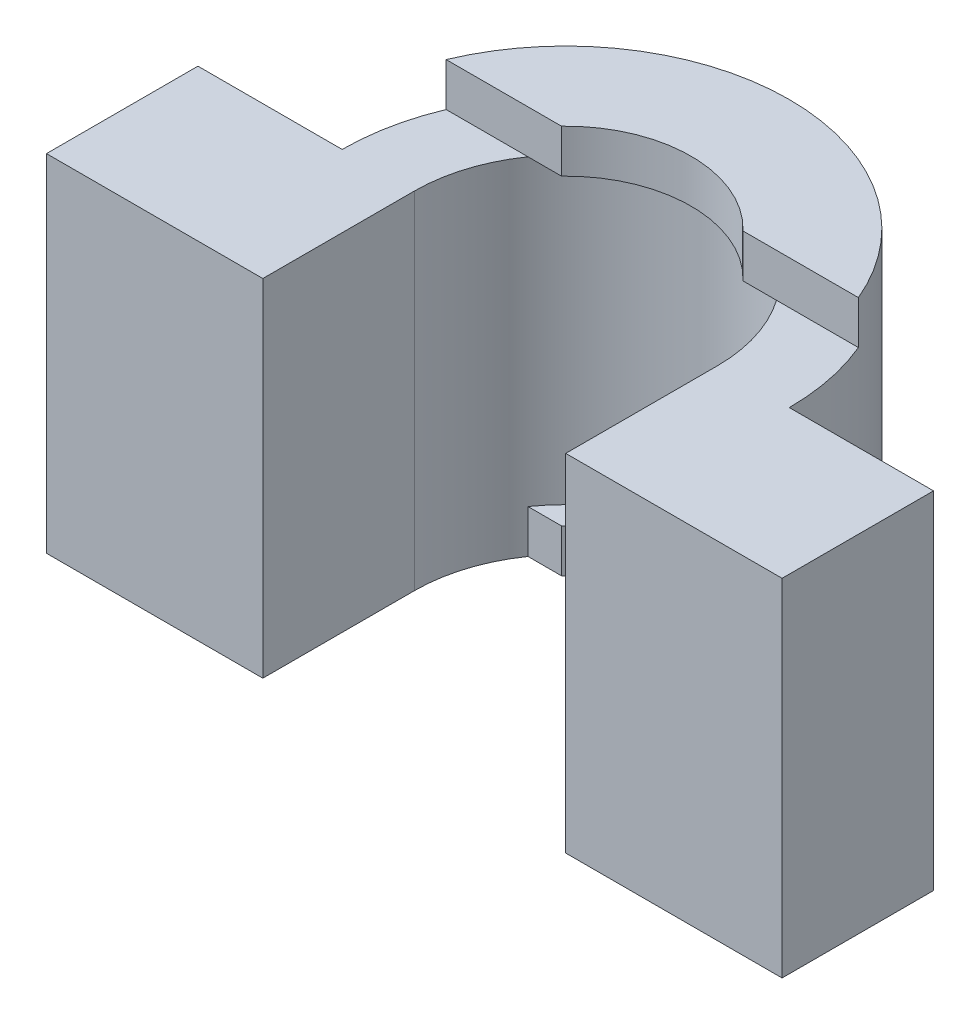
ISO-10303-21;
HEADER;
FILE_DESCRIPTION(('STEP AP214'),'2;1');
FILE_NAME('part.step','',(''),(''),'','','');
FILE_SCHEMA(('AUTOMOTIVE_DESIGN { 1 0 10303 214 1 1 1 1 }'));
ENDSEC;
DATA;
#1=APPLICATION_CONTEXT('core data for automotive mechanical design processes');
#2=APPLICATION_PROTOCOL_DEFINITION('international standard','automotive_design',2000,#1);
#3=PRODUCT_CONTEXT('',#1,'mechanical');
#4=PRODUCT('Part','Part','',(#3));
#5=PRODUCT_RELATED_PRODUCT_CATEGORY('part','',(#4));
#6=PRODUCT_DEFINITION_FORMATION('','',#4);
#7=PRODUCT_DEFINITION_CONTEXT('part definition',#1,'design');
#8=PRODUCT_DEFINITION('design','',#6,#7);
#9=PRODUCT_DEFINITION_SHAPE('','',#8);
#10=(LENGTH_UNIT() NAMED_UNIT(*) SI_UNIT(.MILLI.,.METRE.));
#11=(NAMED_UNIT(*) PLANE_ANGLE_UNIT() SI_UNIT($,.RADIAN.));
#12=(NAMED_UNIT(*) SI_UNIT($,.STERADIAN.) SOLID_ANGLE_UNIT());
#13=UNCERTAINTY_MEASURE_WITH_UNIT(LENGTH_MEASURE(1.E-05),#10,'distance_accuracy_value','');
#14=(GEOMETRIC_REPRESENTATION_CONTEXT(3) GLOBAL_UNCERTAINTY_ASSIGNED_CONTEXT((#13)) GLOBAL_UNIT_ASSIGNED_CONTEXT((#10,
#11,#12)) REPRESENTATION_CONTEXT('',''));
#15=CARTESIAN_POINT('',(0.,0.,0.));
#16=DIRECTION('',(0.,0.,1.));
#17=DIRECTION('',(1.,0.,0.));
#18=AXIS2_PLACEMENT_3D('',#15,#16,#17);
#19=CARTESIAN_POINT('',(10.4344630708231,-3.,-7.42857142857143));
#20=DIRECTION('',(0.,0.,-1.));
#21=DIRECTION('',(-1.,0.,0.));
#22=AXIS2_PLACEMENT_3D('',#19,#20,#21);
#23=PLANE('',#22);
#24=DIRECTION('',(0.,1.,0.));
#25=VECTOR('',#24,1.);
#26=CARTESIAN_POINT('',(4.75970111266418,-3.,-7.42857142857143));
#27=LINE('',#26,#25);
#28=CARTESIAN_POINT('',(4.75970111266418,-3.,-7.42857142857143));
#29=VERTEX_POINT('',#28);
#30=CARTESIAN_POINT('',(4.75970111266418,0.,-7.42857142857143));
#31=VERTEX_POINT('',#30);
#32=EDGE_CURVE('E52',#29,#31,#27,.T.);
#33=ORIENTED_EDGE('',*,*,#32,.T.);
#34=DIRECTION('',(-1.,0.,0.));
#35=VECTOR('',#34,1.);
#36=CARTESIAN_POINT('',(10.4344630708231,0.,-7.42857142857143));
#37=LINE('',#36,#35);
#38=CARTESIAN_POINT('',(2.43446307082313,0.,-7.42857142857143));
#39=VERTEX_POINT('',#38);
#40=EDGE_CURVE('E219',#31,#39,#37,.T.);
#41=ORIENTED_EDGE('',*,*,#40,.T.);
#42=DIRECTION('',(0.,1.,0.));
#43=VECTOR('',#42,1.);
#44=CARTESIAN_POINT('',(2.43446307082313,-3.,-7.42857142857143));
#45=LINE('',#44,#43);
#46=CARTESIAN_POINT('',(2.43446307082313,-3.,-7.42857142857143));
#47=VERTEX_POINT('',#46);
#48=EDGE_CURVE('E235',#47,#39,#45,.T.);
#49=ORIENTED_EDGE('',*,*,#48,.F.);
#50=DIRECTION('',(-1.,0.,0.));
#51=VECTOR('',#50,1.);
#52=CARTESIAN_POINT('',(10.4344630708231,-3.,-7.42857142857143));
#53=LINE('',#52,#51);
#54=EDGE_CURVE('E189',#29,#47,#53,.T.);
#55=ORIENTED_EDGE('',*,*,#54,.F.);
#56=EDGE_LOOP('',(#33,#41,#49,#55));
#57=FACE_BOUND('',#56,.T.);
#58=ADVANCED_FACE('F35',(#57),#23,.F.);
#59=CARTESIAN_POINT('',(-10.1487487851089,-3.,-7.42857142857143));
#60=DIRECTION('',(0.,0.,-1.));
#61=DIRECTION('',(-1.,0.,0.));
#62=AXIS2_PLACEMENT_3D('',#59,#60,#61);
#63=PLANE('',#62);
#64=DIRECTION('',(0.,1.,0.));
#65=VECTOR('',#64,1.);
#66=CARTESIAN_POINT('',(-12.4739868269499,-3.,-7.42857142857143));
#67=LINE('',#66,#65);
#68=CARTESIAN_POINT('',(-12.4739868269499,-3.,-7.42857142857143));
#69=VERTEX_POINT('',#68);
#70=CARTESIAN_POINT('',(-12.4739868269499,0.,-7.42857142857143));
#71=VERTEX_POINT('',#70);
#72=EDGE_CURVE('E218',#69,#71,#67,.T.);
#73=ORIENTED_EDGE('',*,*,#72,.F.);
#74=DIRECTION('',(-1.,0.,0.));
#75=VECTOR('',#74,1.);
#76=CARTESIAN_POINT('',(-10.1487487851089,-3.,-7.42857142857143));
#77=LINE('',#76,#75);
#78=CARTESIAN_POINT('',(-10.1487487851088,-3.,-7.42857142857143));
#79=VERTEX_POINT('',#78);
#80=EDGE_CURVE('E224',#79,#69,#77,.T.);
#81=ORIENTED_EDGE('',*,*,#80,.F.);
#82=DIRECTION('',(0.,1.,0.));
#83=VECTOR('',#82,1.);
#84=CARTESIAN_POINT('',(-10.1487487851088,-3.,-7.42857142857143));
#85=LINE('',#84,#83);
#86=CARTESIAN_POINT('',(-10.1487487851088,0.,-7.42857142857143));
#87=VERTEX_POINT('',#86);
#88=EDGE_CURVE('E227',#79,#87,#85,.T.);
#89=ORIENTED_EDGE('',*,*,#88,.T.);
#90=DIRECTION('',(-1.,0.,0.));
#91=VECTOR('',#90,1.);
#92=CARTESIAN_POINT('',(-10.1487487851089,0.,-7.42857142857143));
#93=LINE('',#92,#91);
#94=EDGE_CURVE('E190',#87,#71,#93,.T.);
#95=ORIENTED_EDGE('',*,*,#94,.T.);
#96=EDGE_LOOP('',(#73,#81,#89,#95));
#97=FACE_BOUND('',#96,.T.);
#98=ADVANCED_FACE('F371',(#97),#63,.F.);
#99=CARTESIAN_POINT('',(0.,21.,0.));
#100=DIRECTION('',(0.,1.,0.));
#101=DIRECTION('',(0.,0.,1.));
#102=AXIS2_PLACEMENT_3D('',#99,#100,#101);
#103=PLANE('',#102);
#104=DIRECTION('',(1.,0.,0.));
#105=VECTOR('',#104,1.);
#106=CARTESIAN_POINT('',(2.43446340044912,21.,-7.42857142857143));
#107=LINE('',#106,#105);
#108=CARTESIAN_POINT('',(4.75970111266418,21.,-7.42857142857143));
#109=VERTEX_POINT('',#108);
#110=CARTESIAN_POINT('',(10.4344630708136,21.,-7.42857142857143));
#111=VERTEX_POINT('',#110);
#112=EDGE_CURVE('E11',#109,#111,#107,.T.);
#113=ORIENTED_EDGE('',*,*,#112,.F.);
#114=CARTESIAN_POINT('',(-3.85714285714286,21.,-1.42857142857142));
#115=DIRECTION('',(0.,1.,0.));
#116=DIRECTION('',(0.,0.,1.));
#117=AXIS2_PLACEMENT_3D('',#114,#115,#116);
#118=CIRCLE('',#117,10.5);
#119=CARTESIAN_POINT('',(6.64285714285714,21.,-1.42857142857143));
#120=VERTEX_POINT('',#119);
#121=EDGE_CURVE('E316',#109,#120,#118,.F.);
#122=ORIENTED_EDGE('',*,*,#121,.T.);
#123=DIRECTION('',(0.,0.,1.));
#124=VECTOR('',#123,1.);
#125=CARTESIAN_POINT('',(6.64285714285714,21.,0.));
#126=LINE('',#125,#124);
#127=CARTESIAN_POINT('',(6.64285714285714,21.,9.07142857142857));
#128=VERTEX_POINT('',#127);
#129=EDGE_CURVE('E311',#120,#128,#126,.T.);
#130=ORIENTED_EDGE('',*,*,#129,.T.);
#131=DIRECTION('',(1.,0.,0.));
#132=VECTOR('',#131,1.);
#133=CARTESIAN_POINT('',(0.,21.,9.07142857142857));
#134=LINE('',#133,#132);
#135=CARTESIAN_POINT('',(21.6428571428571,21.,9.07142857142857));
#136=VERTEX_POINT('',#135);
#137=EDGE_CURVE('E309',#128,#136,#134,.T.);
#138=ORIENTED_EDGE('',*,*,#137,.T.);
#139=DIRECTION('',(0.,0.,1.));
#140=VECTOR('',#139,1.);
#141=CARTESIAN_POINT('',(21.6428571428571,21.,0.));
#142=LINE('',#141,#140);
#143=CARTESIAN_POINT('',(21.6428571428571,21.,-1.42857142857143));
#144=VERTEX_POINT('',#143);
#145=EDGE_CURVE('E306',#144,#136,#142,.T.);
#146=ORIENTED_EDGE('',*,*,#145,.F.);
#147=DIRECTION('',(1.,0.,0.));
#148=VECTOR('',#147,1.);
#149=CARTESIAN_POINT('',(0.,21.,-1.42857142857143));
#150=LINE('',#149,#148);
#151=CARTESIAN_POINT('',(11.6428571428571,21.,-1.42857142857143));
#152=VERTEX_POINT('',#151);
#153=EDGE_CURVE('E178',#152,#144,#150,.T.);
#154=ORIENTED_EDGE('',*,*,#153,.F.);
#155=CARTESIAN_POINT('',(-3.85714285714286,21.,-1.42857142857143));
#156=DIRECTION('',(0.,1.,0.));
#157=DIRECTION('',(0.,0.,1.));
#158=AXIS2_PLACEMENT_3D('',#155,#156,#157);
#159=CIRCLE('',#158,15.5);
#160=EDGE_CURVE('E172',#111,#152,#159,.F.);
#161=ORIENTED_EDGE('',*,*,#160,.F.);
#162=EDGE_LOOP('',(#113,#122,#130,#138,#146,#154,#161));
#163=FACE_BOUND('',#162,.T.);
#164=ADVANCED_FACE('F377',(#163),#103,.T.);
#165=CARTESIAN_POINT('',(-3.85714285714286,21.,-1.42857142857143));
#166=DIRECTION('',(0.,-1.,0.));
#167=DIRECTION('',(0.,0.,-1.));
#168=AXIS2_PLACEMENT_3D('',#165,#166,#167);
#169=CYLINDRICAL_SURFACE('',#168,15.5);
#170=DIRECTION('',(0.,-1.,0.));
#171=VECTOR('',#170,1.);
#172=CARTESIAN_POINT('',(11.6428571428571,21.,-1.42857142857143));
#173=LINE('',#172,#171);
#174=CARTESIAN_POINT('',(11.6428571428571,-3.,-1.42857142857143));
#175=VERTEX_POINT('',#174);
#176=EDGE_CURVE('E167',#152,#175,#173,.T.);
#177=ORIENTED_EDGE('',*,*,#176,.T.);
#178=CARTESIAN_POINT('',(-3.85714285714286,-3.,-1.42857142857143));
#179=DIRECTION('',(0.,-1.,0.));
#180=DIRECTION('',(0.,0.,1.));
#181=AXIS2_PLACEMENT_3D('',#178,#179,#180);
#182=CIRCLE('',#181,15.5000000000088);
#183=CARTESIAN_POINT('',(-19.3571428571429,-3.,-1.42857142857143));
#184=VERTEX_POINT('',#183);
#185=EDGE_CURVE('E169',#184,#175,#182,.T.);
#186=ORIENTED_EDGE('',*,*,#185,.F.);
#187=DIRECTION('',(0.,-1.,0.));
#188=VECTOR('',#187,1.);
#189=CARTESIAN_POINT('',(-19.3571428571429,21.,-1.42857142857143));
#190=LINE('',#189,#188);
#191=CARTESIAN_POINT('',(-19.3571428571429,21.,-1.42857142857143));
#192=VERTEX_POINT('',#191);
#193=EDGE_CURVE('E44',#192,#184,#190,.T.);
#194=ORIENTED_EDGE('',*,*,#193,.F.);
#195=CARTESIAN_POINT('',(-18.1487487850993,21.,-7.42857142857143));
#196=VERTEX_POINT('',#195);
#197=EDGE_CURVE('E285',#192,#196,#159,.F.);
#198=ORIENTED_EDGE('',*,*,#197,.T.);
#199=DIRECTION('',(0.,-1.,0.));
#200=VECTOR('',#199,1.);
#201=CARTESIAN_POINT('',(-18.1487491147348,24.,-7.42857142857143));
#202=LINE('',#201,#200);
#203=CARTESIAN_POINT('',(-18.1487491147348,24.,-7.42857142857143));
#204=VERTEX_POINT('',#203);
#205=EDGE_CURVE('E259',#204,#196,#202,.T.);
#206=ORIENTED_EDGE('',*,*,#205,.F.);
#207=CARTESIAN_POINT('',(-3.85714285714286,24.,-1.42857142857143));
#208=DIRECTION('',(0.,1.,0.));
#209=DIRECTION('',(0.,0.,-1.));
#210=AXIS2_PLACEMENT_3D('',#207,#208,#209);
#211=CIRCLE('',#210,15.5000003039368);
#212=CARTESIAN_POINT('',(10.4344634004491,24.,-7.42857142857143));
#213=VERTEX_POINT('',#212);
#214=EDGE_CURVE('E239',#213,#204,#211,.T.);
#215=ORIENTED_EDGE('',*,*,#214,.F.);
#216=DIRECTION('',(0.,-1.,0.));
#217=VECTOR('',#216,1.);
#218=CARTESIAN_POINT('',(10.4344634004491,24.,-7.42857142857143));
#219=LINE('',#218,#217);
#220=EDGE_CURVE('E249',#213,#111,#219,.T.);
#221=ORIENTED_EDGE('',*,*,#220,.T.);
#222=ORIENTED_EDGE('',*,*,#160,.T.);
#223=EDGE_LOOP('',(#177,#186,#194,#198,#206,#215,#221,#222));
#224=FACE_BOUND('',#223,.T.);
#225=ADVANCED_FACE('F37',(#224),#169,.T.);
#226=CARTESIAN_POINT('',(0.,21.,-1.42857142857143));
#227=DIRECTION('',(0.,0.,1.));
#228=DIRECTION('',(1.,0.,0.));
#229=AXIS2_PLACEMENT_3D('',#226,#227,#228);
#230=PLANE('',#229);
#231=ORIENTED_EDGE('',*,*,#193,.T.);
#232=DIRECTION('',(1.,0.,0.));
#233=VECTOR('',#232,1.);
#234=CARTESIAN_POINT('',(-29.3571428571429,-3.,-1.42857142857143));
#235=LINE('',#234,#233);
#236=CARTESIAN_POINT('',(-29.3571428571429,-3.,-1.42857142857143));
#237=VERTEX_POINT('',#236);
#238=EDGE_CURVE('E188',#237,#184,#235,.T.);
#239=ORIENTED_EDGE('',*,*,#238,.F.);
#240=DIRECTION('',(0.,-1.,0.));
#241=VECTOR('',#240,1.);
#242=CARTESIAN_POINT('',(-29.3571428571429,21.,-1.42857142857143));
#243=LINE('',#242,#241);
#244=CARTESIAN_POINT('',(-29.3571428571429,21.,-1.42857142857143));
#245=VERTEX_POINT('',#244);
#246=EDGE_CURVE('E289',#245,#237,#243,.T.);
#247=ORIENTED_EDGE('',*,*,#246,.F.);
#248=DIRECTION('',(-1.,0.,0.));
#249=VECTOR('',#248,1.);
#250=CARTESIAN_POINT('',(0.,21.,-1.42857142857143));
#251=LINE('',#250,#249);
#252=EDGE_CURVE('E281',#192,#245,#251,.T.);
#253=ORIENTED_EDGE('',*,*,#252,.F.);
#254=EDGE_LOOP('',(#231,#239,#247,#253));
#255=FACE_BOUND('',#254,.T.);
#256=ADVANCED_FACE('F330',(#255),#230,.F.);
#257=CARTESIAN_POINT('',(-29.3571428571429,21.,0.));
#258=DIRECTION('',(1.,0.,0.));
#259=DIRECTION('',(0.,0.,-1.));
#260=AXIS2_PLACEMENT_3D('',#257,#258,#259);
#261=PLANE('',#260);
#262=ORIENTED_EDGE('',*,*,#246,.T.);
#263=DIRECTION('',(0.,0.,-1.));
#264=VECTOR('',#263,1.);
#265=CARTESIAN_POINT('',(-29.3571428571429,-3.,9.07142857142858));
#266=LINE('',#265,#264);
#267=CARTESIAN_POINT('',(-29.3571428571429,-3.,9.07142857142858));
#268=VERTEX_POINT('',#267);
#269=EDGE_CURVE('E215',#268,#237,#266,.T.);
#270=ORIENTED_EDGE('',*,*,#269,.F.);
#271=DIRECTION('',(0.,-1.,0.));
#272=VECTOR('',#271,1.);
#273=CARTESIAN_POINT('',(-29.3571428571429,21.,9.07142857142858));
#274=LINE('',#273,#272);
#275=CARTESIAN_POINT('',(-29.3571428571429,21.,9.07142857142858));
#276=VERTEX_POINT('',#275);
#277=EDGE_CURVE('E291',#276,#268,#274,.T.);
#278=ORIENTED_EDGE('',*,*,#277,.F.);
#279=DIRECTION('',(0.,0.,1.));
#280=VECTOR('',#279,1.);
#281=CARTESIAN_POINT('',(-29.3571428571429,21.,0.));
#282=LINE('',#281,#280);
#283=EDGE_CURVE('E321',#245,#276,#282,.T.);
#284=ORIENTED_EDGE('',*,*,#283,.F.);
#285=EDGE_LOOP('',(#262,#270,#278,#284));
#286=FACE_BOUND('',#285,.T.);
#287=ADVANCED_FACE('F333',(#286),#261,.F.);
#288=CARTESIAN_POINT('',(0.,21.,9.07142857142858));
#289=DIRECTION('',(0.,0.,-1.));
#290=DIRECTION('',(-1.,0.,0.));
#291=AXIS2_PLACEMENT_3D('',#288,#289,#290);
#292=PLANE('',#291);
#293=ORIENTED_EDGE('',*,*,#277,.T.);
#294=DIRECTION('',(-1.,0.,0.));
#295=VECTOR('',#294,1.);
#296=CARTESIAN_POINT('',(-14.3571428571429,-3.,9.07142857142858));
#297=LINE('',#296,#295);
#298=CARTESIAN_POINT('',(-14.3571428571429,-3.,9.07142857142858));
#299=VERTEX_POINT('',#298);
#300=EDGE_CURVE('E212',#299,#268,#297,.T.);
#301=ORIENTED_EDGE('',*,*,#300,.F.);
#302=DIRECTION('',(0.,-1.,0.));
#303=VECTOR('',#302,1.);
#304=CARTESIAN_POINT('',(-14.3571428571429,21.,9.07142857142858));
#305=LINE('',#304,#303);
#306=CARTESIAN_POINT('',(-14.3571428571429,21.,9.07142857142858));
#307=VERTEX_POINT('',#306);
#308=EDGE_CURVE('E293',#307,#299,#305,.T.);
#309=ORIENTED_EDGE('',*,*,#308,.F.);
#310=DIRECTION('',(1.,0.,0.));
#311=VECTOR('',#310,1.);
#312=CARTESIAN_POINT('',(0.,21.,9.07142857142858));
#313=LINE('',#312,#311);
#314=EDGE_CURVE('E320',#276,#307,#313,.T.);
#315=ORIENTED_EDGE('',*,*,#314,.F.);
#316=EDGE_LOOP('',(#293,#301,#309,#315));
#317=FACE_BOUND('',#316,.T.);
#318=ADVANCED_FACE('F338',(#317),#292,.F.);
#319=CARTESIAN_POINT('',(-14.3571428571429,21.,0.));
#320=DIRECTION('',(1.,0.,0.));
#321=DIRECTION('',(0.,0.,-1.));
#322=AXIS2_PLACEMENT_3D('',#319,#320,#321);
#323=PLANE('',#322);
#324=ORIENTED_EDGE('',*,*,#308,.T.);
#325=DIRECTION('',(0.,0.,1.));
#326=VECTOR('',#325,1.);
#327=CARTESIAN_POINT('',(-14.3571428571429,-3.,-1.42857142857143));
#328=LINE('',#327,#326);
#329=CARTESIAN_POINT('',(-14.3571428571429,-3.,-1.42857142857142));
#330=VERTEX_POINT('',#329);
#331=EDGE_CURVE('E209',#330,#299,#328,.T.);
#332=ORIENTED_EDGE('',*,*,#331,.F.);
#333=DIRECTION('',(0.,-1.,0.));
#334=VECTOR('',#333,1.);
#335=CARTESIAN_POINT('',(-14.3571428571429,21.,-1.42857142857143));
#336=LINE('',#335,#334);
#337=CARTESIAN_POINT('',(-14.3571428571429,21.,-1.42857142857143));
#338=VERTEX_POINT('',#337);
#339=EDGE_CURVE('E295',#338,#330,#336,.T.);
#340=ORIENTED_EDGE('',*,*,#339,.F.);
#341=DIRECTION('',(0.,0.,1.));
#342=VECTOR('',#341,1.);
#343=CARTESIAN_POINT('',(-14.3571428571429,21.,0.));
#344=LINE('',#343,#342);
#345=EDGE_CURVE('E317',#338,#307,#344,.T.);
#346=ORIENTED_EDGE('',*,*,#345,.T.);
#347=EDGE_LOOP('',(#324,#332,#340,#346));
#348=FACE_BOUND('',#347,.T.);
#349=ADVANCED_FACE('F343',(#348),#323,.T.);
#350=CARTESIAN_POINT('',(-3.85714285714286,21.,-1.42857142857142));
#351=DIRECTION('',(0.,-1.,0.));
#352=DIRECTION('',(0.,0.,-1.));
#353=AXIS2_PLACEMENT_3D('',#350,#351,#352);
#354=CYLINDRICAL_SURFACE('',#353,10.5);
#355=ORIENTED_EDGE('',*,*,#339,.T.);
#356=CARTESIAN_POINT('',(-3.85714285714286,-3.,-1.42857142857142));
#357=DIRECTION('',(0.,1.,0.));
#358=DIRECTION('',(0.,0.,-1.));
#359=AXIS2_PLACEMENT_3D('',#356,#357,#358);
#360=CIRCLE('',#359,10.5);
#361=EDGE_CURVE('E206',#69,#330,#360,.T.);
#362=ORIENTED_EDGE('',*,*,#361,.F.);
#363=ORIENTED_EDGE('',*,*,#72,.T.);
#364=CARTESIAN_POINT('',(-3.85714285714286,0.,-1.42857142857142));
#365=DIRECTION('',(0.,1.,0.));
#366=DIRECTION('',(0.,0.,1.));
#367=AXIS2_PLACEMENT_3D('',#364,#365,#366);
#368=CIRCLE('',#367,10.5);
#369=EDGE_CURVE('E262',#71,#31,#368,.F.);
#370=ORIENTED_EDGE('',*,*,#369,.T.);
#371=ORIENTED_EDGE('',*,*,#32,.F.);
#372=CARTESIAN_POINT('',(-3.85714285714286,-3.,-1.42857142857142));
#373=DIRECTION('',(0.,1.,0.));
#374=DIRECTION('',(0.,0.,-1.));
#375=AXIS2_PLACEMENT_3D('',#372,#373,#374);
#376=CIRCLE('',#375,10.5);
#377=CARTESIAN_POINT('',(6.64285714285714,-3.,-1.42857142857143));
#378=VERTEX_POINT('',#377);
#379=EDGE_CURVE('E194',#378,#29,#376,.T.);
#380=ORIENTED_EDGE('',*,*,#379,.F.);
#381=DIRECTION('',(0.,-1.,0.));
#382=VECTOR('',#381,1.);
#383=CARTESIAN_POINT('',(6.64285714285714,21.,-1.42857142857143));
#384=LINE('',#383,#382);
#385=EDGE_CURVE('E297',#120,#378,#384,.T.);
#386=ORIENTED_EDGE('',*,*,#385,.F.);
#387=ORIENTED_EDGE('',*,*,#121,.F.);
#388=CARTESIAN_POINT('',(-12.4739868269499,21.,-7.42857142857143));
#389=VERTEX_POINT('',#388);
#390=EDGE_CURVE('E315',#389,#109,#118,.F.);
#391=ORIENTED_EDGE('',*,*,#390,.F.);
#392=EDGE_CURVE('E313',#338,#389,#118,.F.);
#393=ORIENTED_EDGE('',*,*,#392,.F.);
#394=EDGE_LOOP('',(#355,#362,#363,#370,#371,#380,#386,#387,#391,#393));
#395=FACE_BOUND('',#394,.T.);
#396=ADVANCED_FACE('F345',(#395),#354,.F.);
#397=CARTESIAN_POINT('',(6.64285714285714,21.,0.));
#398=DIRECTION('',(1.,0.,0.));
#399=DIRECTION('',(0.,0.,-1.));
#400=AXIS2_PLACEMENT_3D('',#397,#398,#399);
#401=PLANE('',#400);
#402=ORIENTED_EDGE('',*,*,#385,.T.);
#403=DIRECTION('',(0.,0.,-1.));
#404=VECTOR('',#403,1.);
#405=CARTESIAN_POINT('',(6.64285714285714,-3.,9.07142857142857));
#406=LINE('',#405,#404);
#407=CARTESIAN_POINT('',(6.64285714285714,-3.,9.07142857142857));
#408=VERTEX_POINT('',#407);
#409=EDGE_CURVE('E202',#408,#378,#406,.T.);
#410=ORIENTED_EDGE('',*,*,#409,.F.);
#411=DIRECTION('',(0.,-1.,0.));
#412=VECTOR('',#411,1.);
#413=CARTESIAN_POINT('',(6.64285714285714,21.,9.07142857142857));
#414=LINE('',#413,#412);
#415=EDGE_CURVE('E299',#128,#408,#414,.T.);
#416=ORIENTED_EDGE('',*,*,#415,.F.);
#417=ORIENTED_EDGE('',*,*,#129,.F.);
#418=EDGE_LOOP('',(#402,#410,#416,#417));
#419=FACE_BOUND('',#418,.T.);
#420=ADVANCED_FACE('F474',(#419),#401,.F.);
#421=CARTESIAN_POINT('',(0.,21.,9.07142857142857));
#422=DIRECTION('',(0.,0.,-1.));
#423=DIRECTION('',(-1.,0.,0.));
#424=AXIS2_PLACEMENT_3D('',#421,#422,#423);
#425=PLANE('',#424);
#426=ORIENTED_EDGE('',*,*,#415,.T.);
#427=DIRECTION('',(-1.,0.,0.));
#428=VECTOR('',#427,1.);
#429=CARTESIAN_POINT('',(21.6428571428571,-3.,9.07142857142857));
#430=LINE('',#429,#428);
#431=CARTESIAN_POINT('',(21.6428571428571,-3.,9.07142857142857));
#432=VERTEX_POINT('',#431);
#433=EDGE_CURVE('E196',#432,#408,#430,.T.);
#434=ORIENTED_EDGE('',*,*,#433,.F.);
#435=DIRECTION('',(0.,-1.,0.));
#436=VECTOR('',#435,1.);
#437=CARTESIAN_POINT('',(21.6428571428571,21.,9.07142857142857));
#438=LINE('',#437,#436);
#439=EDGE_CURVE('E301',#136,#432,#438,.T.);
#440=ORIENTED_EDGE('',*,*,#439,.F.);
#441=ORIENTED_EDGE('',*,*,#137,.F.);
#442=EDGE_LOOP('',(#426,#434,#440,#441));
#443=FACE_BOUND('',#442,.T.);
#444=ADVANCED_FACE('F483',(#443),#425,.F.);
#445=CARTESIAN_POINT('',(21.6428571428571,21.,0.));
#446=DIRECTION('',(1.,0.,0.));
#447=DIRECTION('',(0.,0.,-1.));
#448=AXIS2_PLACEMENT_3D('',#445,#446,#447);
#449=PLANE('',#448);
#450=ORIENTED_EDGE('',*,*,#439,.T.);
#451=DIRECTION('',(0.,0.,1.));
#452=VECTOR('',#451,1.);
#453=CARTESIAN_POINT('',(21.6428571428571,-3.,-1.42857142857143));
#454=LINE('',#453,#452);
#455=CARTESIAN_POINT('',(21.6428571428571,-3.,-1.42857142857143));
#456=VERTEX_POINT('',#455);
#457=EDGE_CURVE('E193',#456,#432,#454,.T.);
#458=ORIENTED_EDGE('',*,*,#457,.F.);
#459=DIRECTION('',(0.,-1.,0.));
#460=VECTOR('',#459,1.);
#461=CARTESIAN_POINT('',(21.6428571428571,21.,-1.42857142857143));
#462=LINE('',#461,#460);
#463=EDGE_CURVE('E177',#144,#456,#462,.T.);
#464=ORIENTED_EDGE('',*,*,#463,.F.);
#465=ORIENTED_EDGE('',*,*,#145,.T.);
#466=EDGE_LOOP('',(#450,#458,#464,#465));
#467=FACE_BOUND('',#466,.T.);
#468=ADVANCED_FACE('F494',(#467),#449,.T.);
#469=CARTESIAN_POINT('',(0.,21.,-1.42857142857143));
#470=DIRECTION('',(0.,0.,-1.));
#471=DIRECTION('',(-1.,0.,0.));
#472=AXIS2_PLACEMENT_3D('',#469,#470,#471);
#473=PLANE('',#472);
#474=ORIENTED_EDGE('',*,*,#463,.T.);
#475=DIRECTION('',(1.,0.,0.));
#476=VECTOR('',#475,1.);
#477=CARTESIAN_POINT('',(11.6428571428571,-3.,-1.42857142857143));
#478=LINE('',#477,#476);
#479=EDGE_CURVE('E184',#175,#456,#478,.T.);
#480=ORIENTED_EDGE('',*,*,#479,.F.);
#481=ORIENTED_EDGE('',*,*,#176,.F.);
#482=ORIENTED_EDGE('',*,*,#153,.T.);
#483=EDGE_LOOP('',(#474,#480,#481,#482));
#484=FACE_BOUND('',#483,.T.);
#485=ADVANCED_FACE('F192',(#484),#473,.T.);
#486=DIRECTION('',(1.,0.,0.));
#487=VECTOR('',#486,1.);
#488=CARTESIAN_POINT('',(-18.1487491147348,21.,-7.42857142857143));
#489=LINE('',#488,#487);
#490=EDGE_CURVE('E252',#196,#389,#489,.T.);
#491=ORIENTED_EDGE('',*,*,#490,.F.);
#492=ORIENTED_EDGE('',*,*,#197,.F.);
#493=ORIENTED_EDGE('',*,*,#252,.T.);
#494=ORIENTED_EDGE('',*,*,#283,.T.);
#495=ORIENTED_EDGE('',*,*,#314,.T.);
#496=ORIENTED_EDGE('',*,*,#345,.F.);
#497=ORIENTED_EDGE('',*,*,#392,.T.);
#498=EDGE_LOOP('',(#491,#492,#493,#494,#495,#496,#497));
#499=FACE_BOUND('',#498,.T.);
#500=ADVANCED_FACE('F328',(#499),#103,.T.);
#501=CARTESIAN_POINT('',(-18.1487491147348,24.,-7.42857142857143));
#502=DIRECTION('',(0.,0.,-1.));
#503=DIRECTION('',(-1.,0.,0.));
#504=AXIS2_PLACEMENT_3D('',#501,#502,#503);
#505=PLANE('',#504);
#506=ORIENTED_EDGE('',*,*,#490,.T.);
#507=CARTESIAN_POINT('',(-10.1487491147348,21.,-7.42857142857143));
#508=VERTEX_POINT('',#507);
#509=EDGE_CURVE('E238',#389,#508,#489,.T.);
#510=ORIENTED_EDGE('',*,*,#509,.T.);
#511=DIRECTION('',(0.,-1.,0.));
#512=VECTOR('',#511,1.);
#513=CARTESIAN_POINT('',(-10.1487491147348,24.,-7.42857142857143));
#514=LINE('',#513,#512);
#515=CARTESIAN_POINT('',(-10.1487491147348,24.,-7.42857142857143));
#516=VERTEX_POINT('',#515);
#517=EDGE_CURVE('E263',#516,#508,#514,.T.);
#518=ORIENTED_EDGE('',*,*,#517,.F.);
#519=DIRECTION('',(1.,0.,0.));
#520=VECTOR('',#519,1.);
#521=CARTESIAN_POINT('',(-18.1487491147348,24.,-7.42857142857143));
#522=LINE('',#521,#520);
#523=EDGE_CURVE('E242',#204,#516,#522,.T.);
#524=ORIENTED_EDGE('',*,*,#523,.F.);
#525=ORIENTED_EDGE('',*,*,#205,.T.);
#526=EDGE_LOOP('',(#506,#510,#518,#524,#525));
#527=FACE_BOUND('',#526,.T.);
#528=ADVANCED_FACE('F354',(#527),#505,.F.);
#529=CARTESIAN_POINT('',(-3.85714285714286,24.,-1.42857142857142));
#530=DIRECTION('',(0.,-1.,0.));
#531=DIRECTION('',(0.,0.,-1.));
#532=AXIS2_PLACEMENT_3D('',#529,#530,#531);
#533=CYLINDRICAL_SURFACE('',#532,8.69392369995105);
#534=CARTESIAN_POINT('',(-3.85714285714286,21.,-1.42857142857142));
#535=DIRECTION('',(0.,-1.,0.));
#536=DIRECTION('',(0.,0.,-1.));
#537=AXIS2_PLACEMENT_3D('',#534,#535,#536);
#538=CIRCLE('',#537,8.69392369995105);
#539=CARTESIAN_POINT('',(2.43446340044912,21.,-7.42857142857143));
#540=VERTEX_POINT('',#539);
#541=EDGE_CURVE('E253',#508,#540,#538,.T.);
#542=ORIENTED_EDGE('',*,*,#541,.T.);
#543=DIRECTION('',(0.,-1.,0.));
#544=VECTOR('',#543,1.);
#545=CARTESIAN_POINT('',(2.43446340044912,24.,-7.42857142857143));
#546=LINE('',#545,#544);
#547=CARTESIAN_POINT('',(2.43446340044912,24.,-7.42857142857143));
#548=VERTEX_POINT('',#547);
#549=EDGE_CURVE('E265',#548,#540,#546,.T.);
#550=ORIENTED_EDGE('',*,*,#549,.F.);
#551=CARTESIAN_POINT('',(-3.85714285714286,24.,-1.42857142857142));
#552=DIRECTION('',(0.,-1.,0.));
#553=DIRECTION('',(0.,0.,-1.));
#554=AXIS2_PLACEMENT_3D('',#551,#552,#553);
#555=CIRCLE('',#554,8.69392369995105);
#556=EDGE_CURVE('E245',#516,#548,#555,.T.);
#557=ORIENTED_EDGE('',*,*,#556,.F.);
#558=ORIENTED_EDGE('',*,*,#517,.T.);
#559=EDGE_LOOP('',(#542,#550,#557,#558));
#560=FACE_BOUND('',#559,.T.);
#561=ADVANCED_FACE('F361',(#560),#533,.F.);
#562=CARTESIAN_POINT('',(2.43446340044912,24.,-7.42857142857143));
#563=DIRECTION('',(0.,0.,-1.));
#564=DIRECTION('',(-1.,0.,0.));
#565=AXIS2_PLACEMENT_3D('',#562,#563,#564);
#566=PLANE('',#565);
#567=EDGE_CURVE('E243',#540,#109,#107,.T.);
#568=ORIENTED_EDGE('',*,*,#567,.T.);
#569=ORIENTED_EDGE('',*,*,#112,.T.);
#570=ORIENTED_EDGE('',*,*,#220,.F.);
#571=DIRECTION('',(1.,0.,0.));
#572=VECTOR('',#571,1.);
#573=CARTESIAN_POINT('',(2.43446340044912,24.,-7.42857142857143));
#574=LINE('',#573,#572);
#575=EDGE_CURVE('E247',#548,#213,#574,.T.);
#576=ORIENTED_EDGE('',*,*,#575,.F.);
#577=ORIENTED_EDGE('',*,*,#549,.T.);
#578=EDGE_LOOP('',(#568,#569,#570,#576,#577));
#579=FACE_BOUND('',#578,.T.);
#580=ADVANCED_FACE('F359',(#579),#566,.F.);
#581=CARTESIAN_POINT('',(-3.85714285714286,24.,-1.42857142857143));
#582=DIRECTION('',(0.,-1.,0.));
#583=DIRECTION('',(0.,0.,-1.));
#584=AXIS2_PLACEMENT_3D('',#581,#582,#583);
#585=PLANE('',#584);
#586=ORIENTED_EDGE('',*,*,#214,.T.);
#587=ORIENTED_EDGE('',*,*,#523,.T.);
#588=ORIENTED_EDGE('',*,*,#556,.T.);
#589=ORIENTED_EDGE('',*,*,#575,.T.);
#590=EDGE_LOOP('',(#586,#587,#588,#589));
#591=FACE_BOUND('',#590,.T.);
#592=ADVANCED_FACE('F357',(#591),#585,.F.);
#593=CARTESIAN_POINT('',(-3.85714285714286,21.,-1.42857142857143));
#594=DIRECTION('',(0.,-1.,0.));
#595=DIRECTION('',(0.,0.,-1.));
#596=AXIS2_PLACEMENT_3D('',#593,#594,#595);
#597=PLANE('',#596);
#598=ORIENTED_EDGE('',*,*,#509,.F.);
#599=ORIENTED_EDGE('',*,*,#390,.T.);
#600=ORIENTED_EDGE('',*,*,#567,.F.);
#601=ORIENTED_EDGE('',*,*,#541,.F.);
#602=EDGE_LOOP('',(#598,#599,#600,#601));
#603=FACE_BOUND('',#602,.T.);
#604=ADVANCED_FACE('F351',(#603),#597,.T.);
#605=CARTESIAN_POINT('',(-3.85714285714286,0.,-1.42857142857143));
#606=DIRECTION('',(0.,1.,0.));
#607=DIRECTION('',(0.,0.,1.));
#608=AXIS2_PLACEMENT_3D('',#605,#606,#607);
#609=PLANE('',#608);
#610=ORIENTED_EDGE('',*,*,#369,.F.);
#611=ORIENTED_EDGE('',*,*,#94,.F.);
#612=CARTESIAN_POINT('',(-3.85714285714286,0.,-1.42857142857142));
#613=DIRECTION('',(0.,1.,0.));
#614=DIRECTION('',(0.,0.,1.));
#615=AXIS2_PLACEMENT_3D('',#612,#613,#614);
#616=CIRCLE('',#615,8.69392346140779);
#617=EDGE_CURVE('E229',#39,#87,#616,.T.);
#618=ORIENTED_EDGE('',*,*,#617,.F.);
#619=ORIENTED_EDGE('',*,*,#40,.F.);
#620=EDGE_LOOP('',(#610,#611,#618,#619));
#621=FACE_BOUND('',#620,.T.);
#622=ADVANCED_FACE('F386',(#621),#609,.T.);
#623=CARTESIAN_POINT('',(-3.85714285714286,-3.,-1.42857142857142));
#624=DIRECTION('',(0.,1.,0.));
#625=DIRECTION('',(0.,0.,1.));
#626=AXIS2_PLACEMENT_3D('',#623,#624,#625);
#627=CYLINDRICAL_SURFACE('',#626,8.69392346140779);
#628=ORIENTED_EDGE('',*,*,#617,.T.);
#629=ORIENTED_EDGE('',*,*,#88,.F.);
#630=CARTESIAN_POINT('',(-3.85714285714286,-3.,-1.42857142857142));
#631=DIRECTION('',(0.,1.,0.));
#632=DIRECTION('',(0.,0.,1.));
#633=AXIS2_PLACEMENT_3D('',#630,#631,#632);
#634=CIRCLE('',#633,8.69392346140779);
#635=EDGE_CURVE('E222',#47,#79,#634,.T.);
#636=ORIENTED_EDGE('',*,*,#635,.F.);
#637=ORIENTED_EDGE('',*,*,#48,.T.);
#638=EDGE_LOOP('',(#628,#629,#636,#637));
#639=FACE_BOUND('',#638,.T.);
#640=ADVANCED_FACE('F382',(#639),#627,.F.);
#641=CARTESIAN_POINT('',(-3.85714285714286,-3.,-1.42857142857143));
#642=DIRECTION('',(0.,1.,0.));
#643=DIRECTION('',(0.,0.,1.));
#644=AXIS2_PLACEMENT_3D('',#641,#642,#643);
#645=PLANE('',#644);
#646=ORIENTED_EDGE('',*,*,#185,.T.);
#647=ORIENTED_EDGE('',*,*,#479,.T.);
#648=ORIENTED_EDGE('',*,*,#457,.T.);
#649=ORIENTED_EDGE('',*,*,#433,.T.);
#650=ORIENTED_EDGE('',*,*,#409,.T.);
#651=ORIENTED_EDGE('',*,*,#379,.T.);
#652=ORIENTED_EDGE('',*,*,#54,.T.);
#653=ORIENTED_EDGE('',*,*,#635,.T.);
#654=ORIENTED_EDGE('',*,*,#80,.T.);
#655=ORIENTED_EDGE('',*,*,#361,.T.);
#656=ORIENTED_EDGE('',*,*,#331,.T.);
#657=ORIENTED_EDGE('',*,*,#300,.T.);
#658=ORIENTED_EDGE('',*,*,#269,.T.);
#659=ORIENTED_EDGE('',*,*,#238,.T.);
#660=EDGE_LOOP('',(#646,#647,#648,#649,#650,#651,#652,#653,#654,#655,#656,#657,#658,#659));
#661=FACE_BOUND('',#660,.T.);
#662=ADVANCED_FACE('F182',(#661),#645,.F.);
#663=CLOSED_SHELL('',(#58,#98,#164,#225,#256,#287,#318,#349,#396,#420,#444,#468,#485,#500,#528,
#561,#580,#592,#604,#622,#640,#662));
#664=MANIFOLD_SOLID_BREP('B2',#663);
#665=ADVANCED_BREP_SHAPE_REPRESENTATION('',(#18,#664),#14);
#666=SHAPE_DEFINITION_REPRESENTATION(#9,#665);
ENDSEC;
END-ISO-10303-21;
